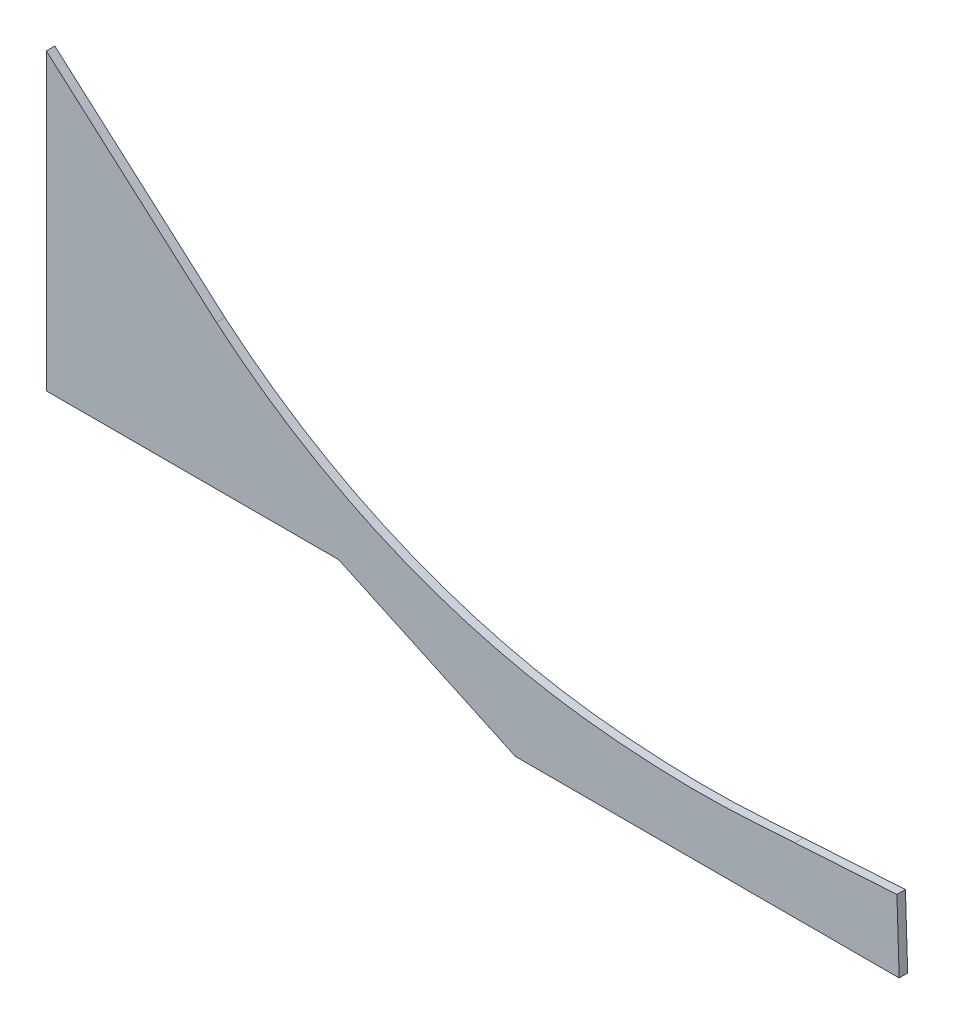
ISO-10303-21;
HEADER;
FILE_DESCRIPTION(('STEP AP214'),'2;1');
FILE_NAME('part.step','',(''),(''),'','','');
FILE_SCHEMA(('AUTOMOTIVE_DESIGN { 1 0 10303 214 1 1 1 1 }'));
ENDSEC;
DATA;
#1=APPLICATION_CONTEXT('core data for automotive mechanical design processes');
#2=APPLICATION_PROTOCOL_DEFINITION('international standard','automotive_design',2000,#1);
#3=PRODUCT_CONTEXT('',#1,'mechanical');
#4=PRODUCT('Part','Part','',(#3));
#5=PRODUCT_RELATED_PRODUCT_CATEGORY('part','',(#4));
#6=PRODUCT_DEFINITION_FORMATION('','',#4);
#7=PRODUCT_DEFINITION_CONTEXT('part definition',#1,'design');
#8=PRODUCT_DEFINITION('design','',#6,#7);
#9=PRODUCT_DEFINITION_SHAPE('','',#8);
#10=(LENGTH_UNIT() NAMED_UNIT(*) SI_UNIT(.MILLI.,.METRE.));
#11=(NAMED_UNIT(*) PLANE_ANGLE_UNIT() SI_UNIT($,.RADIAN.));
#12=(NAMED_UNIT(*) SI_UNIT($,.STERADIAN.) SOLID_ANGLE_UNIT());
#13=UNCERTAINTY_MEASURE_WITH_UNIT(LENGTH_MEASURE(1.E-05),#10,'distance_accuracy_value','');
#14=(GEOMETRIC_REPRESENTATION_CONTEXT(3) GLOBAL_UNCERTAINTY_ASSIGNED_CONTEXT((#13)) GLOBAL_UNIT_ASSIGNED_CONTEXT((#10,
#11,#12)) REPRESENTATION_CONTEXT('',''));
#15=CARTESIAN_POINT('',(0.,0.,0.));
#16=DIRECTION('',(0.,0.,1.));
#17=DIRECTION('',(1.,0.,0.));
#18=AXIS2_PLACEMENT_3D('',#15,#16,#17);
#19=CARTESIAN_POINT('',(-70.,0.,1.));
#20=DIRECTION('',(0.,1.,0.));
#21=DIRECTION('',(0.,0.,1.));
#22=AXIS2_PLACEMENT_3D('',#19,#20,#21);
#23=PLANE('',#22);
#24=DIRECTION('',(1.,0.,0.));
#25=VECTOR('',#24,1.);
#26=CARTESIAN_POINT('',(-70.,0.,0.));
#27=LINE('',#26,#25);
#28=CARTESIAN_POINT('',(-70.,0.,0.));
#29=VERTEX_POINT('',#28);
#30=CARTESIAN_POINT('',(-35.6406112135589,0.,0.));
#31=VERTEX_POINT('',#30);
#32=EDGE_CURVE('E165',#29,#31,#27,.T.);
#33=ORIENTED_EDGE('',*,*,#32,.T.);
#34=DIRECTION('',(0.,0.,-1.));
#35=VECTOR('',#34,1.);
#36=CARTESIAN_POINT('',(-35.6406112135589,0.,1.));
#37=LINE('',#36,#35);
#38=CARTESIAN_POINT('',(-35.6406112135589,0.,1.));
#39=VERTEX_POINT('',#38);
#40=EDGE_CURVE('E11',#39,#31,#37,.T.);
#41=ORIENTED_EDGE('',*,*,#40,.F.);
#42=DIRECTION('',(1.,0.,0.));
#43=VECTOR('',#42,1.);
#44=CARTESIAN_POINT('',(-70.,0.,1.));
#45=LINE('',#44,#43);
#46=CARTESIAN_POINT('',(-70.,0.,1.));
#47=VERTEX_POINT('',#46);
#48=EDGE_CURVE('E190',#47,#39,#45,.T.);
#49=ORIENTED_EDGE('',*,*,#48,.F.);
#50=DIRECTION('',(0.,0.,-1.));
#51=VECTOR('',#50,1.);
#52=CARTESIAN_POINT('',(-70.,0.,1.));
#53=LINE('',#52,#51);
#54=EDGE_CURVE('E191',#47,#29,#53,.T.);
#55=ORIENTED_EDGE('',*,*,#54,.T.);
#56=EDGE_LOOP('',(#33,#41,#49,#55));
#57=FACE_BOUND('',#56,.T.);
#58=ADVANCED_FACE('F33',(#57),#23,.F.);
#59=CARTESIAN_POINT('',(-35.6406112135589,0.,1.));
#60=DIRECTION('',(0.420897740412862,0.907108092850762,0.));
#61=DIRECTION('',(-0.907108092850762,0.420897740412862,0.));
#62=AXIS2_PLACEMENT_3D('',#59,#60,#61);
#63=PLANE('',#62);
#64=DIRECTION('',(0.907108092850762,-0.420897740412862,0.));
#65=VECTOR('',#64,1.);
#66=CARTESIAN_POINT('',(-35.6406112135589,0.,0.));
#67=LINE('',#66,#65);
#68=CARTESIAN_POINT('',(-14.8556677009275,-9.64420428835797,0.));
#69=VERTEX_POINT('',#68);
#70=EDGE_CURVE('E156',#31,#69,#67,.T.);
#71=ORIENTED_EDGE('',*,*,#70,.T.);
#72=DIRECTION('',(0.,0.,-1.));
#73=VECTOR('',#72,1.);
#74=CARTESIAN_POINT('',(-14.8556677009275,-9.64420428835797,1.));
#75=LINE('',#74,#73);
#76=CARTESIAN_POINT('',(-14.8556677009275,-9.64420428835797,1.));
#77=VERTEX_POINT('',#76);
#78=EDGE_CURVE('E41',#77,#69,#75,.T.);
#79=ORIENTED_EDGE('',*,*,#78,.F.);
#80=DIRECTION('',(0.907108092850762,-0.420897740412862,0.));
#81=VECTOR('',#80,1.);
#82=CARTESIAN_POINT('',(-35.6406112135589,0.,1.));
#83=LINE('',#82,#81);
#84=EDGE_CURVE('E91',#39,#77,#83,.T.);
#85=ORIENTED_EDGE('',*,*,#84,.F.);
#86=ORIENTED_EDGE('',*,*,#40,.T.);
#87=EDGE_LOOP('',(#71,#79,#85,#86));
#88=FACE_BOUND('',#87,.T.);
#89=ADVANCED_FACE('F149',(#88),#63,.F.);
#90=CARTESIAN_POINT('',(-14.8556677009275,-9.64420428835797,1.));
#91=DIRECTION('',(0.,1.,0.));
#92=DIRECTION('',(0.,0.,1.));
#93=AXIS2_PLACEMENT_3D('',#90,#91,#92);
#94=PLANE('',#93);
#95=DIRECTION('',(1.,0.,0.));
#96=VECTOR('',#95,1.);
#97=CARTESIAN_POINT('',(-14.8556677009275,-9.64420428835797,0.));
#98=LINE('',#97,#96);
#99=CARTESIAN_POINT('',(30.2642833452883,-9.64420428835797,0.));
#100=VERTEX_POINT('',#99);
#101=EDGE_CURVE('E164',#69,#100,#98,.T.);
#102=ORIENTED_EDGE('',*,*,#101,.T.);
#103=DIRECTION('',(0.,0.,-1.));
#104=VECTOR('',#103,1.);
#105=CARTESIAN_POINT('',(30.2642833452883,-9.64420428835797,1.));
#106=LINE('',#105,#104);
#107=CARTESIAN_POINT('',(30.2642833452883,-9.64420428835797,1.));
#108=VERTEX_POINT('',#107);
#109=EDGE_CURVE('E170',#108,#100,#106,.T.);
#110=ORIENTED_EDGE('',*,*,#109,.F.);
#111=DIRECTION('',(1.,0.,0.));
#112=VECTOR('',#111,1.);
#113=CARTESIAN_POINT('',(-14.8556677009275,-9.64420428835797,1.));
#114=LINE('',#113,#112);
#115=EDGE_CURVE('E169',#77,#108,#114,.T.);
#116=ORIENTED_EDGE('',*,*,#115,.F.);
#117=ORIENTED_EDGE('',*,*,#78,.T.);
#118=EDGE_LOOP('',(#102,#110,#116,#117));
#119=FACE_BOUND('',#118,.T.);
#120=ADVANCED_FACE('F146',(#119),#94,.F.);
#121=CARTESIAN_POINT('',(30.2642833452883,-9.64420428835797,1.));
#122=DIRECTION('',(-0.999502778360692,-0.0315308745400189,0.));
#123=DIRECTION('',(0.0315308745400189,-0.999502778360691,0.));
#124=AXIS2_PLACEMENT_3D('',#121,#122,#123);
#125=PLANE('',#124);
#126=DIRECTION('',(-0.0315308745400189,0.999502778360691,0.));
#127=VECTOR('',#126,1.);
#128=CARTESIAN_POINT('',(30.2642833452883,-9.64420428835797,0.));
#129=LINE('',#128,#127);
#130=CARTESIAN_POINT('',(30.,-1.26663970305517,0.));
#131=VERTEX_POINT('',#130);
#132=EDGE_CURVE('E175',#100,#131,#129,.T.);
#133=ORIENTED_EDGE('',*,*,#132,.T.);
#134=DIRECTION('',(0.,0.,-1.));
#135=VECTOR('',#134,1.);
#136=CARTESIAN_POINT('',(30.,-1.26663970305517,1.));
#137=LINE('',#136,#135);
#138=CARTESIAN_POINT('',(30.,-1.26663970305517,1.));
#139=VERTEX_POINT('',#138);
#140=EDGE_CURVE('E195',#139,#131,#137,.T.);
#141=ORIENTED_EDGE('',*,*,#140,.F.);
#142=DIRECTION('',(-0.0315308745400189,0.999502778360691,0.));
#143=VECTOR('',#142,1.);
#144=CARTESIAN_POINT('',(30.2642833452883,-9.64420428835797,1.));
#145=LINE('',#144,#143);
#146=EDGE_CURVE('E124',#108,#139,#145,.T.);
#147=ORIENTED_EDGE('',*,*,#146,.F.);
#148=ORIENTED_EDGE('',*,*,#109,.T.);
#149=EDGE_LOOP('',(#133,#141,#147,#148));
#150=FACE_BOUND('',#149,.T.);
#151=ADVANCED_FACE('F142',(#150),#125,.F.);
#152=CARTESIAN_POINT('',(18.,-2.01113665697501,1.));
#153=DIRECTION('',(-0.0619223534775271,0.998080969731316,0.));
#154=DIRECTION('',(-0.998080969731316,-0.0619223534775272,0.));
#155=AXIS2_PLACEMENT_3D('',#152,#153,#154);
#156=PLANE('',#155);
#157=DIRECTION('',(0.998080969731316,0.0619223534775271,0.));
#158=VECTOR('',#157,1.);
#159=CARTESIAN_POINT('',(18.,-2.01113665697501,0.));
#160=LINE('',#159,#158);
#161=CARTESIAN_POINT('',(18.,-2.01113665697501,0.));
#162=VERTEX_POINT('',#161);
#163=EDGE_CURVE('E177',#162,#131,#160,.T.);
#164=ORIENTED_EDGE('',*,*,#163,.F.);
#165=DIRECTION('',(0.,0.,-1.));
#166=VECTOR('',#165,1.);
#167=CARTESIAN_POINT('',(18.,-2.01113665697501,1.));
#168=LINE('',#167,#166);
#169=CARTESIAN_POINT('',(18.,-2.01113665697501,1.));
#170=VERTEX_POINT('',#169);
#171=EDGE_CURVE('E113',#170,#162,#168,.T.);
#172=ORIENTED_EDGE('',*,*,#171,.F.);
#173=DIRECTION('',(0.998080969731316,0.0619223534775271,0.));
#174=VECTOR('',#173,1.);
#175=CARTESIAN_POINT('',(18.,-2.01113665697501,1.));
#176=LINE('',#175,#174);
#177=EDGE_CURVE('E122',#170,#139,#176,.T.);
#178=ORIENTED_EDGE('',*,*,#177,.T.);
#179=ORIENTED_EDGE('',*,*,#140,.T.);
#180=EDGE_LOOP('',(#164,#172,#178,#179));
#181=FACE_BOUND('',#180,.T.);
#182=ADVANCED_FACE('F138',(#181),#156,.T.);
#183=CARTESIAN_POINT('',(-50.,16.9664082250715,1.));
#184=CARTESIAN_POINT('',(-43.9912266639606,11.871570216858,1.));
#185=CARTESIAN_POINT('',(-34.1775641899711,5.79558331942847,1.));
#186=CARTESIAN_POINT('',(-20.1816407480624,0.787148233066327,1.));
#187=CARTESIAN_POINT('',(-10.092446875304,-1.45782146018249,1.));
#188=CARTESIAN_POINT('',(-0.0263097858117901,-2.4566176669256,1.));
#189=CARTESIAN_POINT('',(9.34362323450871,-2.64271269065036,1.));
#190=CARTESIAN_POINT('',(15.3338397795431,-2.17654900387438,1.));
#191=CARTESIAN_POINT('',(18.,-2.01113665697501,1.));
#192=B_SPLINE_CURVE_WITH_KNOTS('',3,(#183,#184,#185,#186,#187,#188,#189,#190,#191),
.UNSPECIFIED.,.F.,.F.,(4,1,1,1,1,1,4),(0.,0.325390077747912,0.471834545990438,0.61305923304981,
0.751676122605643,0.889537620482623,1.),.UNSPECIFIED.);
#193=DIRECTION('',(0.,0.,-1.));
#194=VECTOR('',#193,1.);
#195=SURFACE_OF_LINEAR_EXTRUSION('',#192,#194);
#196=CARTESIAN_POINT('',(-50.,16.9664082250715,0.));
#197=CARTESIAN_POINT('',(-43.9912266639606,11.871570216858,0.));
#198=CARTESIAN_POINT('',(-34.1775641899711,5.79558331942847,0.));
#199=CARTESIAN_POINT('',(-20.1816407480624,0.787148233066327,0.));
#200=CARTESIAN_POINT('',(-10.092446875304,-1.45782146018249,0.));
#201=CARTESIAN_POINT('',(-0.0263097858117901,-2.4566176669256,0.));
#202=CARTESIAN_POINT('',(9.34362323450871,-2.64271269065036,0.));
#203=CARTESIAN_POINT('',(15.3338397795431,-2.17654900387438,0.));
#204=CARTESIAN_POINT('',(18.,-2.01113665697501,0.));
#205=B_SPLINE_CURVE_WITH_KNOTS('',3,(#196,#197,#198,#199,#200,#201,#202,#203,#204),
.UNSPECIFIED.,.F.,.F.,(4,1,1,1,1,1,4),(0.,0.325390077747912,0.471834545990438,0.61305923304981,
0.751676122605643,0.889537620482623,1.),.UNSPECIFIED.);
#206=CARTESIAN_POINT('',(-50.,16.9664082250715,0.));
#207=VERTEX_POINT('',#206);
#208=EDGE_CURVE('E112',#207,#162,#205,.T.);
#209=ORIENTED_EDGE('',*,*,#208,.F.);
#210=DIRECTION('',(0.,0.,-1.));
#211=VECTOR('',#210,1.);
#212=CARTESIAN_POINT('',(-50.,16.9664082250715,1.));
#213=LINE('',#212,#211);
#214=CARTESIAN_POINT('',(-50.,16.9664082250715,1.));
#215=VERTEX_POINT('',#214);
#216=EDGE_CURVE('E106',#215,#207,#213,.T.);
#217=ORIENTED_EDGE('',*,*,#216,.F.);
#218=EDGE_CURVE('E110',#215,#170,#192,.T.);
#219=ORIENTED_EDGE('',*,*,#218,.T.);
#220=ORIENTED_EDGE('',*,*,#171,.T.);
#221=EDGE_LOOP('',(#209,#217,#219,#220));
#222=FACE_BOUND('',#221,.T.);
#223=ADVANCED_FACE('F108',(#222),#195,.T.);
#224=CARTESIAN_POINT('',(-50.,16.9664082250715,1.));
#225=DIRECTION('',(-0.661621755890231,-0.74983775053856,0.));
#226=DIRECTION('',(0.74983775053856,-0.661621755890231,0.));
#227=AXIS2_PLACEMENT_3D('',#224,#225,#226);
#228=PLANE('',#227);
#229=DIRECTION('',(-0.74983775053856,0.661621755890231,0.));
#230=VECTOR('',#229,1.);
#231=CARTESIAN_POINT('',(-50.,16.9664082250715,0.));
#232=LINE('',#231,#230);
#233=CARTESIAN_POINT('',(-70.,34.613472684417,0.));
#234=VERTEX_POINT('',#233);
#235=EDGE_CURVE('E77',#207,#234,#232,.T.);
#236=ORIENTED_EDGE('',*,*,#235,.T.);
#237=DIRECTION('',(0.,0.,-1.));
#238=VECTOR('',#237,1.);
#239=CARTESIAN_POINT('',(-70.,34.613472684417,1.));
#240=LINE('',#239,#238);
#241=CARTESIAN_POINT('',(-70.,34.613472684417,1.));
#242=VERTEX_POINT('',#241);
#243=EDGE_CURVE('E114',#242,#234,#240,.T.);
#244=ORIENTED_EDGE('',*,*,#243,.F.);
#245=DIRECTION('',(-0.74983775053856,0.661621755890231,0.));
#246=VECTOR('',#245,1.);
#247=CARTESIAN_POINT('',(-50.,16.9664082250715,1.));
#248=LINE('',#247,#246);
#249=EDGE_CURVE('E116',#215,#242,#248,.T.);
#250=ORIENTED_EDGE('',*,*,#249,.F.);
#251=ORIENTED_EDGE('',*,*,#216,.T.);
#252=EDGE_LOOP('',(#236,#244,#250,#251));
#253=FACE_BOUND('',#252,.T.);
#254=ADVANCED_FACE('F117',(#253),#228,.F.);
#255=CARTESIAN_POINT('',(-70.,34.613472684417,1.));
#256=DIRECTION('',(1.,0.,0.));
#257=DIRECTION('',(0.,1.,0.));
#258=AXIS2_PLACEMENT_3D('',#255,#256,#257);
#259=PLANE('',#258);
#260=DIRECTION('',(0.,-1.,0.));
#261=VECTOR('',#260,1.);
#262=CARTESIAN_POINT('',(-70.,34.613472684417,0.));
#263=LINE('',#262,#261);
#264=EDGE_CURVE('E83',#234,#29,#263,.T.);
#265=ORIENTED_EDGE('',*,*,#264,.T.);
#266=ORIENTED_EDGE('',*,*,#54,.F.);
#267=DIRECTION('',(0.,-1.,0.));
#268=VECTOR('',#267,1.);
#269=CARTESIAN_POINT('',(-70.,34.613472684417,1.));
#270=LINE('',#269,#268);
#271=EDGE_CURVE('E49',#242,#47,#270,.T.);
#272=ORIENTED_EDGE('',*,*,#271,.F.);
#273=ORIENTED_EDGE('',*,*,#243,.T.);
#274=EDGE_LOOP('',(#265,#266,#272,#273));
#275=FACE_BOUND('',#274,.T.);
#276=ADVANCED_FACE('F204',(#275),#259,.F.);
#277=CARTESIAN_POINT('',(-18.0282152812154,0.419572700893346,1.));
#278=DIRECTION('',(0.,0.,-1.));
#279=DIRECTION('',(-1.,0.,0.));
#280=AXIS2_PLACEMENT_3D('',#277,#278,#279);
#281=PLANE('',#280);
#282=ORIENTED_EDGE('',*,*,#48,.T.);
#283=ORIENTED_EDGE('',*,*,#84,.T.);
#284=ORIENTED_EDGE('',*,*,#115,.T.);
#285=ORIENTED_EDGE('',*,*,#146,.T.);
#286=ORIENTED_EDGE('',*,*,#177,.F.);
#287=ORIENTED_EDGE('',*,*,#218,.F.);
#288=ORIENTED_EDGE('',*,*,#249,.T.);
#289=ORIENTED_EDGE('',*,*,#271,.T.);
#290=EDGE_LOOP('',(#282,#283,#284,#285,#286,#287,#288,#289));
#291=FACE_BOUND('',#290,.T.);
#292=ADVANCED_FACE('F120',(#291),#281,.F.);
#293=CARTESIAN_POINT('',(-18.0282152812154,0.419572700893346,0.));
#294=DIRECTION('',(0.,0.,-1.));
#295=DIRECTION('',(-1.,0.,0.));
#296=AXIS2_PLACEMENT_3D('',#293,#294,#295);
#297=PLANE('',#296);
#298=ORIENTED_EDGE('',*,*,#32,.F.);
#299=ORIENTED_EDGE('',*,*,#264,.F.);
#300=ORIENTED_EDGE('',*,*,#235,.F.);
#301=ORIENTED_EDGE('',*,*,#208,.T.);
#302=ORIENTED_EDGE('',*,*,#163,.T.);
#303=ORIENTED_EDGE('',*,*,#132,.F.);
#304=ORIENTED_EDGE('',*,*,#101,.F.);
#305=ORIENTED_EDGE('',*,*,#70,.F.);
#306=EDGE_LOOP('',(#298,#299,#300,#301,#302,#303,#304,#305));
#307=FACE_BOUND('',#306,.T.);
#308=ADVANCED_FACE('F172',(#307),#297,.T.);
#309=CLOSED_SHELL('',(#58,#89,#120,#151,#182,#223,#254,#276,#292,#308));
#310=MANIFOLD_SOLID_BREP('B2',#309);
#311=ADVANCED_BREP_SHAPE_REPRESENTATION('',(#18,#310),#14);
#312=SHAPE_DEFINITION_REPRESENTATION(#9,#311);
ENDSEC;
END-ISO-10303-21;
